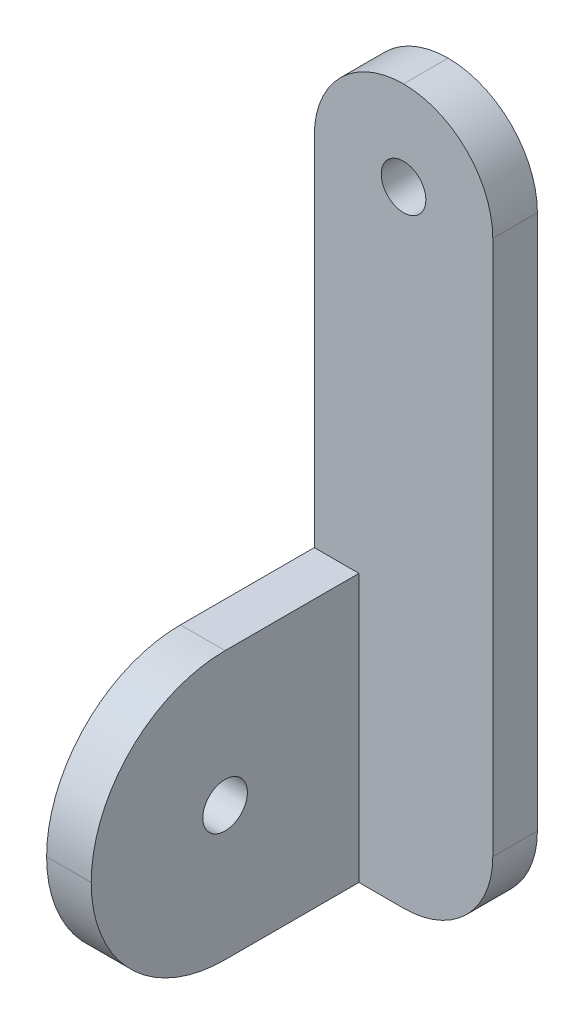
ISO-10303-21;
HEADER;
FILE_DESCRIPTION(('STEP AP214'),'2;1');
FILE_NAME('part.step','',(''),(''),'','','');
FILE_SCHEMA(('AUTOMOTIVE_DESIGN { 1 0 10303 214 1 1 1 1 }'));
ENDSEC;
DATA;
#1=APPLICATION_CONTEXT('core data for automotive mechanical design processes');
#2=APPLICATION_PROTOCOL_DEFINITION('international standard','automotive_design',2000,#1);
#3=PRODUCT_CONTEXT('',#1,'mechanical');
#4=PRODUCT('Part','Part','',(#3));
#5=PRODUCT_RELATED_PRODUCT_CATEGORY('part','',(#4));
#6=PRODUCT_DEFINITION_FORMATION('','',#4);
#7=PRODUCT_DEFINITION_CONTEXT('part definition',#1,'design');
#8=PRODUCT_DEFINITION('design','',#6,#7);
#9=PRODUCT_DEFINITION_SHAPE('','',#8);
#10=(LENGTH_UNIT() NAMED_UNIT(*) SI_UNIT(.MILLI.,.METRE.));
#11=(NAMED_UNIT(*) PLANE_ANGLE_UNIT() SI_UNIT($,.RADIAN.));
#12=(NAMED_UNIT(*) SI_UNIT($,.STERADIAN.) SOLID_ANGLE_UNIT());
#13=UNCERTAINTY_MEASURE_WITH_UNIT(LENGTH_MEASURE(1.E-05),#10,'distance_accuracy_value','');
#14=(GEOMETRIC_REPRESENTATION_CONTEXT(3) GLOBAL_UNCERTAINTY_ASSIGNED_CONTEXT((#13)) GLOBAL_UNIT_ASSIGNED_CONTEXT((#10,
#11,#12)) REPRESENTATION_CONTEXT('',''));
#15=CARTESIAN_POINT('',(0.,0.,0.));
#16=DIRECTION('',(0.,0.,1.));
#17=DIRECTION('',(1.,0.,0.));
#18=AXIS2_PLACEMENT_3D('',#15,#16,#17);
#19=CARTESIAN_POINT('',(-43.6932648054146,39.2711505922166,5.));
#20=DIRECTION('',(1.,0.,0.));
#21=DIRECTION('',(0.,1.,0.));
#22=AXIS2_PLACEMENT_3D('',#19,#20,#21);
#23=PLANE('',#22);
#24=CARTESIAN_POINT('',(-43.6932648054145,-25.7288494077834,20.));
#25=DIRECTION('',(-1.,0.,0.));
#26=DIRECTION('',(0.,-1.,0.));
#27=AXIS2_PLACEMENT_3D('',#24,#25,#26);
#28=CIRCLE('',#27,2.5);
#29=CARTESIAN_POINT('',(-43.6932648054145,-28.2288494077834,20.));
#30=VERTEX_POINT('',#29);
#31=EDGE_CURVE('E135',#30,#30,#28,.T.);
#32=ORIENTED_EDGE('',*,*,#31,.F.);
#33=EDGE_LOOP('',(#32));
#34=FACE_BOUND('',#33,.T.);
#35=DIRECTION('',(0.,-1.,0.));
#36=VECTOR('',#35,1.);
#37=CARTESIAN_POINT('',(-43.6932648054146,39.2711505922166,5.));
#38=LINE('',#37,#36);
#39=CARTESIAN_POINT('',(-43.6932648054146,29.2711505922166,5.));
#40=VERTEX_POINT('',#39);
#41=CARTESIAN_POINT('',(-43.6932648054145,-10.7288494077834,5.));
#42=VERTEX_POINT('',#41);
#43=EDGE_CURVE('E127',#40,#42,#38,.T.);
#44=ORIENTED_EDGE('',*,*,#43,.F.);
#45=DIRECTION('',(0.,0.,-1.));
#46=VECTOR('',#45,1.);
#47=CARTESIAN_POINT('',(-43.6932648054146,29.2711505922166,5.));
#48=LINE('',#47,#46);
#49=CARTESIAN_POINT('',(-43.6932648054146,29.2711505922166,0.));
#50=VERTEX_POINT('',#49);
#51=EDGE_CURVE('E11',#40,#50,#48,.T.);
#52=ORIENTED_EDGE('',*,*,#51,.T.);
#53=DIRECTION('',(0.,-1.,0.));
#54=VECTOR('',#53,1.);
#55=CARTESIAN_POINT('',(-43.6932648054146,39.2711505922166,0.));
#56=LINE('',#55,#54);
#57=CARTESIAN_POINT('',(-43.6932648054145,-40.7288494077834,0.));
#58=VERTEX_POINT('',#57);
#59=EDGE_CURVE('E193',#50,#58,#56,.T.);
#60=ORIENTED_EDGE('',*,*,#59,.T.);
#61=DIRECTION('',(0.,0.,-1.));
#62=VECTOR('',#61,1.);
#63=CARTESIAN_POINT('',(-43.6932648054145,-40.7288494077834,5.));
#64=LINE('',#63,#62);
#65=CARTESIAN_POINT('',(-43.6932648054145,-40.7288494077834,20.));
#66=VERTEX_POINT('',#65);
#67=EDGE_CURVE('E153',#66,#58,#64,.T.);
#68=ORIENTED_EDGE('',*,*,#67,.F.);
#69=CARTESIAN_POINT('',(-43.6932648054145,-25.7288494077834,20.));
#70=DIRECTION('',(1.,0.,0.));
#71=DIRECTION('',(0.,1.,0.));
#72=AXIS2_PLACEMENT_3D('',#69,#70,#71);
#73=CIRCLE('',#72,15.);
#74=CARTESIAN_POINT('',(-43.6932648054145,-25.7288494077834,35.));
#75=VERTEX_POINT('',#74);
#76=EDGE_CURVE('E162',#66,#75,#73,.F.);
#77=ORIENTED_EDGE('',*,*,#76,.T.);
#78=CARTESIAN_POINT('',(-43.6932648054145,-25.7288494077834,20.));
#79=DIRECTION('',(1.,0.,0.));
#80=DIRECTION('',(0.,1.,0.));
#81=AXIS2_PLACEMENT_3D('',#78,#79,#80);
#82=CIRCLE('',#81,15.);
#83=CARTESIAN_POINT('',(-43.6932648054145,-10.7288494077834,20.));
#84=VERTEX_POINT('',#83);
#85=EDGE_CURVE('E158',#75,#84,#82,.F.);
#86=ORIENTED_EDGE('',*,*,#85,.T.);
#87=DIRECTION('',(0.,0.,-1.));
#88=VECTOR('',#87,1.);
#89=CARTESIAN_POINT('',(-43.6932648054145,-10.7288494077834,35.));
#90=LINE('',#89,#88);
#91=EDGE_CURVE('E119',#84,#42,#90,.T.);
#92=ORIENTED_EDGE('',*,*,#91,.T.);
#93=EDGE_LOOP('',(#44,#52,#60,#68,#77,#86,#92));
#94=FACE_BOUND('',#93,.T.);
#95=ADVANCED_FACE('F33',(#34,#94),#23,.F.);
#96=CARTESIAN_POINT('',(-43.6932648054145,-40.7288494077834,5.));
#97=DIRECTION('',(0.,1.,0.));
#98=DIRECTION('',(0.,0.,1.));
#99=AXIS2_PLACEMENT_3D('',#96,#97,#98);
#100=PLANE('',#99);
#101=DIRECTION('',(1.,0.,0.));
#102=VECTOR('',#101,1.);
#103=CARTESIAN_POINT('',(-43.6932648054145,-40.7288494077834,0.));
#104=LINE('',#103,#102);
#105=CARTESIAN_POINT('',(-33.6932648054145,-40.7288494077834,0.));
#106=VERTEX_POINT('',#105);
#107=EDGE_CURVE('E195',#58,#106,#104,.T.);
#108=ORIENTED_EDGE('',*,*,#107,.T.);
#109=DIRECTION('',(0.,0.,-1.));
#110=VECTOR('',#109,1.);
#111=CARTESIAN_POINT('',(-33.6932648054145,-40.7288494077834,5.));
#112=LINE('',#111,#110);
#113=CARTESIAN_POINT('',(-33.6932648054145,-40.7288494077834,5.));
#114=VERTEX_POINT('',#113);
#115=EDGE_CURVE('E180',#106,#114,#112,.F.);
#116=ORIENTED_EDGE('',*,*,#115,.T.);
#117=DIRECTION('',(1.,0.,0.));
#118=VECTOR('',#117,1.);
#119=CARTESIAN_POINT('',(-43.6932648054145,-40.7288494077834,5.));
#120=LINE('',#119,#118);
#121=CARTESIAN_POINT('',(-38.6932648054145,-40.7288494077834,5.));
#122=VERTEX_POINT('',#121);
#123=EDGE_CURVE('E139',#122,#114,#120,.T.);
#124=ORIENTED_EDGE('',*,*,#123,.F.);
#125=DIRECTION('',(0.,0.,-1.));
#126=VECTOR('',#125,1.);
#127=CARTESIAN_POINT('',(-38.6932648054145,-40.7288494077834,35.));
#128=LINE('',#127,#126);
#129=CARTESIAN_POINT('',(-38.6932648054145,-40.7288494077834,20.));
#130=VERTEX_POINT('',#129);
#131=EDGE_CURVE('E118',#130,#122,#128,.T.);
#132=ORIENTED_EDGE('',*,*,#131,.F.);
#133=DIRECTION('',(1.,0.,0.));
#134=VECTOR('',#133,1.);
#135=CARTESIAN_POINT('',(-43.6932648054145,-40.7288494077834,20.));
#136=LINE('',#135,#134);
#137=EDGE_CURVE('E155',#130,#66,#136,.F.);
#138=ORIENTED_EDGE('',*,*,#137,.T.);
#139=ORIENTED_EDGE('',*,*,#67,.T.);
#140=EDGE_LOOP('',(#108,#116,#124,#132,#138,#139));
#141=FACE_BOUND('',#140,.T.);
#142=ADVANCED_FACE('F204',(#141),#100,.F.);
#143=CARTESIAN_POINT('',(-23.6932648054146,39.2711505922166,5.));
#144=DIRECTION('',(-1.,0.,0.));
#145=DIRECTION('',(0.,-1.,0.));
#146=AXIS2_PLACEMENT_3D('',#143,#144,#145);
#147=PLANE('',#146);
#148=DIRECTION('',(0.,1.,0.));
#149=VECTOR('',#148,1.);
#150=CARTESIAN_POINT('',(-23.6932648054146,39.2711505922166,5.));
#151=LINE('',#150,#149);
#152=CARTESIAN_POINT('',(-23.6932648054145,-30.7288494077834,5.));
#153=VERTEX_POINT('',#152);
#154=CARTESIAN_POINT('',(-23.6932648054146,29.2711505922166,5.));
#155=VERTEX_POINT('',#154);
#156=EDGE_CURVE('E191',#153,#155,#151,.T.);
#157=ORIENTED_EDGE('',*,*,#156,.F.);
#158=DIRECTION('',(0.,0.,-1.));
#159=VECTOR('',#158,1.);
#160=CARTESIAN_POINT('',(-23.6932648054145,-30.7288494077834,5.));
#161=LINE('',#160,#159);
#162=CARTESIAN_POINT('',(-23.6932648054145,-30.7288494077834,0.));
#163=VERTEX_POINT('',#162);
#164=EDGE_CURVE('E171',#153,#163,#161,.T.);
#165=ORIENTED_EDGE('',*,*,#164,.T.);
#166=DIRECTION('',(0.,1.,0.));
#167=VECTOR('',#166,1.);
#168=CARTESIAN_POINT('',(-23.6932648054146,39.2711505922166,0.));
#169=LINE('',#168,#167);
#170=CARTESIAN_POINT('',(-23.6932648054146,29.2711505922166,0.));
#171=VERTEX_POINT('',#170);
#172=EDGE_CURVE('E184',#163,#171,#169,.T.);
#173=ORIENTED_EDGE('',*,*,#172,.T.);
#174=DIRECTION('',(0.,0.,-1.));
#175=VECTOR('',#174,1.);
#176=CARTESIAN_POINT('',(-23.6932648054146,29.2711505922166,5.));
#177=LINE('',#176,#175);
#178=EDGE_CURVE('E165',#171,#155,#177,.F.);
#179=ORIENTED_EDGE('',*,*,#178,.T.);
#180=EDGE_LOOP('',(#157,#165,#173,#179));
#181=FACE_BOUND('',#180,.T.);
#182=ADVANCED_FACE('F219',(#181),#147,.F.);
#183=CARTESIAN_POINT('',(0.,0.,5.));
#184=DIRECTION('',(0.,0.,1.));
#185=DIRECTION('',(1.,0.,0.));
#186=AXIS2_PLACEMENT_3D('',#183,#184,#185);
#187=PLANE('',#186);
#188=ORIENTED_EDGE('',*,*,#123,.T.);
#189=CARTESIAN_POINT('',(-33.6932648054145,-30.7288494077834,5.));
#190=DIRECTION('',(0.,0.,1.));
#191=DIRECTION('',(1.,0.,0.));
#192=AXIS2_PLACEMENT_3D('',#189,#190,#191);
#193=CIRCLE('',#192,10.);
#194=EDGE_CURVE('E42',#114,#153,#193,.T.);
#195=ORIENTED_EDGE('',*,*,#194,.T.);
#196=ORIENTED_EDGE('',*,*,#156,.T.);
#197=CARTESIAN_POINT('',(-33.6932648054146,29.2711505922166,5.));
#198=DIRECTION('',(0.,0.,1.));
#199=DIRECTION('',(1.,0.,0.));
#200=AXIS2_PLACEMENT_3D('',#197,#198,#199);
#201=CIRCLE('',#200,10.);
#202=CARTESIAN_POINT('',(-33.6932648054146,39.2711505922166,5.));
#203=VERTEX_POINT('',#202);
#204=EDGE_CURVE('E54',#155,#203,#201,.T.);
#205=ORIENTED_EDGE('',*,*,#204,.T.);
#206=CARTESIAN_POINT('',(-33.6932648054146,29.2711505922166,5.));
#207=DIRECTION('',(0.,0.,1.));
#208=DIRECTION('',(1.,0.,0.));
#209=AXIS2_PLACEMENT_3D('',#206,#207,#208);
#210=CIRCLE('',#209,10.);
#211=EDGE_CURVE('E49',#203,#40,#210,.T.);
#212=ORIENTED_EDGE('',*,*,#211,.T.);
#213=ORIENTED_EDGE('',*,*,#43,.T.);
#214=DIRECTION('',(-1.,0.,0.));
#215=VECTOR('',#214,1.);
#216=CARTESIAN_POINT('',(-43.6932648054145,-10.7288494077834,5.));
#217=LINE('',#216,#215);
#218=CARTESIAN_POINT('',(-38.6932648054145,-10.7288494077834,5.));
#219=VERTEX_POINT('',#218);
#220=EDGE_CURVE('E112',#219,#42,#217,.T.);
#221=ORIENTED_EDGE('',*,*,#220,.F.);
#222=DIRECTION('',(0.,1.,0.));
#223=VECTOR('',#222,1.);
#224=CARTESIAN_POINT('',(-38.6932648054145,-40.7288494077834,5.));
#225=LINE('',#224,#223);
#226=EDGE_CURVE('E125',#122,#219,#225,.T.);
#227=ORIENTED_EDGE('',*,*,#226,.F.);
#228=EDGE_LOOP('',(#188,#195,#196,#205,#212,#213,#221,#227));
#229=FACE_BOUND('',#228,.T.);
#230=CARTESIAN_POINT('',(-33.6932648054146,29.2711505922166,5.));
#231=DIRECTION('',(0.,0.,1.));
#232=DIRECTION('',(1.,0.,0.));
#233=AXIS2_PLACEMENT_3D('',#230,#231,#232);
#234=CIRCLE('',#233,2.5);
#235=CARTESIAN_POINT('',(-31.1932648054145,29.2711505922166,5.));
#236=VERTEX_POINT('',#235);
#237=EDGE_CURVE('E149',#236,#236,#234,.T.);
#238=ORIENTED_EDGE('',*,*,#237,.F.);
#239=EDGE_LOOP('',(#238));
#240=FACE_BOUND('',#239,.T.);
#241=ADVANCED_FACE('F123',(#229,#240),#187,.T.);
#242=CARTESIAN_POINT('',(0.,0.,0.));
#243=DIRECTION('',(0.,0.,1.));
#244=DIRECTION('',(1.,0.,0.));
#245=AXIS2_PLACEMENT_3D('',#242,#243,#244);
#246=PLANE('',#245);
#247=CARTESIAN_POINT('',(-33.6932648054146,29.2711505922166,0.));
#248=DIRECTION('',(0.,0.,1.));
#249=DIRECTION('',(1.,0.,0.));
#250=AXIS2_PLACEMENT_3D('',#247,#248,#249);
#251=CIRCLE('',#250,2.5);
#252=CARTESIAN_POINT('',(-31.1932648054145,29.2711505922166,0.));
#253=VERTEX_POINT('',#252);
#254=EDGE_CURVE('E196',#253,#253,#251,.T.);
#255=ORIENTED_EDGE('',*,*,#254,.T.);
#256=EDGE_LOOP('',(#255));
#257=FACE_BOUND('',#256,.T.);
#258=ORIENTED_EDGE('',*,*,#172,.F.);
#259=CARTESIAN_POINT('',(-33.6932648054145,-30.7288494077834,0.));
#260=DIRECTION('',(0.,0.,1.));
#261=DIRECTION('',(1.,0.,0.));
#262=AXIS2_PLACEMENT_3D('',#259,#260,#261);
#263=CIRCLE('',#262,10.);
#264=EDGE_CURVE('E178',#163,#106,#263,.F.);
#265=ORIENTED_EDGE('',*,*,#264,.T.);
#266=ORIENTED_EDGE('',*,*,#107,.F.);
#267=ORIENTED_EDGE('',*,*,#59,.F.);
#268=CARTESIAN_POINT('',(-33.6932648054146,29.2711505922166,0.));
#269=DIRECTION('',(0.,0.,1.));
#270=DIRECTION('',(1.,0.,0.));
#271=AXIS2_PLACEMENT_3D('',#268,#269,#270);
#272=CIRCLE('',#271,10.);
#273=CARTESIAN_POINT('',(-33.6932648054146,39.2711505922166,0.));
#274=VERTEX_POINT('',#273);
#275=EDGE_CURVE('E174',#50,#274,#272,.F.);
#276=ORIENTED_EDGE('',*,*,#275,.T.);
#277=CARTESIAN_POINT('',(-33.6932648054146,29.2711505922166,0.));
#278=DIRECTION('',(0.,0.,1.));
#279=DIRECTION('',(1.,0.,0.));
#280=AXIS2_PLACEMENT_3D('',#277,#278,#279);
#281=CIRCLE('',#280,10.);
#282=EDGE_CURVE('E176',#274,#171,#281,.F.);
#283=ORIENTED_EDGE('',*,*,#282,.T.);
#284=EDGE_LOOP('',(#258,#265,#266,#267,#276,#283));
#285=FACE_BOUND('',#284,.T.);
#286=ADVANCED_FACE('F211',(#257,#285),#246,.F.);
#287=CARTESIAN_POINT('',(-33.6932648054146,29.2711505922166,0.));
#288=DIRECTION('',(0.,0.,1.));
#289=DIRECTION('',(1.,0.,0.));
#290=AXIS2_PLACEMENT_3D('',#287,#288,#289);
#291=CYLINDRICAL_SURFACE('',#290,2.5);
#292=ORIENTED_EDGE('',*,*,#254,.F.);
#293=EDGE_LOOP('',(#292));
#294=FACE_BOUND('',#293,.T.);
#295=ORIENTED_EDGE('',*,*,#237,.T.);
#296=EDGE_LOOP('',(#295));
#297=FACE_BOUND('',#296,.T.);
#298=ADVANCED_FACE('F254',(#294,#297),#291,.F.);
#299=CARTESIAN_POINT('',(-38.6932648054145,-40.7288494077834,35.));
#300=DIRECTION('',(-1.,0.,0.));
#301=DIRECTION('',(0.,0.,1.));
#302=AXIS2_PLACEMENT_3D('',#299,#300,#301);
#303=PLANE('',#302);
#304=CARTESIAN_POINT('',(-38.6932648054145,-25.7288494077834,20.));
#305=DIRECTION('',(-1.,0.,0.));
#306=DIRECTION('',(0.,0.,1.));
#307=AXIS2_PLACEMENT_3D('',#304,#305,#306);
#308=CIRCLE('',#307,2.5);
#309=CARTESIAN_POINT('',(-38.6932648054145,-25.7288494077834,22.5));
#310=VERTEX_POINT('',#309);
#311=EDGE_CURVE('E132',#310,#310,#308,.T.);
#312=ORIENTED_EDGE('',*,*,#311,.T.);
#313=EDGE_LOOP('',(#312));
#314=FACE_BOUND('',#313,.T.);
#315=CARTESIAN_POINT('',(-38.6932648054145,-25.7288494077834,20.));
#316=DIRECTION('',(-1.,0.,0.));
#317=DIRECTION('',(0.,0.,1.));
#318=AXIS2_PLACEMENT_3D('',#315,#316,#317);
#319=CIRCLE('',#318,15.);
#320=CARTESIAN_POINT('',(-38.6932648054145,-10.7288494077834,20.));
#321=VERTEX_POINT('',#320);
#322=CARTESIAN_POINT('',(-38.6932648054145,-25.7288494077834,35.));
#323=VERTEX_POINT('',#322);
#324=EDGE_CURVE('E150',#321,#323,#319,.F.);
#325=ORIENTED_EDGE('',*,*,#324,.T.);
#326=CARTESIAN_POINT('',(-38.6932648054145,-25.7288494077834,20.));
#327=DIRECTION('',(-1.,0.,0.));
#328=DIRECTION('',(0.,0.,1.));
#329=AXIS2_PLACEMENT_3D('',#326,#327,#328);
#330=CIRCLE('',#329,15.);
#331=EDGE_CURVE('E152',#323,#130,#330,.F.);
#332=ORIENTED_EDGE('',*,*,#331,.T.);
#333=ORIENTED_EDGE('',*,*,#131,.T.);
#334=ORIENTED_EDGE('',*,*,#226,.T.);
#335=DIRECTION('',(0.,0.,-1.));
#336=VECTOR('',#335,1.);
#337=CARTESIAN_POINT('',(-38.6932648054145,-10.7288494077834,35.));
#338=LINE('',#337,#336);
#339=EDGE_CURVE('E108',#321,#219,#338,.T.);
#340=ORIENTED_EDGE('',*,*,#339,.F.);
#341=EDGE_LOOP('',(#325,#332,#333,#334,#340));
#342=FACE_BOUND('',#341,.T.);
#343=ADVANCED_FACE('F130',(#314,#342),#303,.F.);
#344=CARTESIAN_POINT('',(-43.6932648054145,-10.7288494077834,35.));
#345=DIRECTION('',(0.,-1.,0.));
#346=DIRECTION('',(0.,0.,-1.));
#347=AXIS2_PLACEMENT_3D('',#344,#345,#346);
#348=PLANE('',#347);
#349=ORIENTED_EDGE('',*,*,#91,.F.);
#350=DIRECTION('',(-1.,0.,0.));
#351=VECTOR('',#350,1.);
#352=CARTESIAN_POINT('',(-43.6932648054145,-10.7288494077834,20.));
#353=LINE('',#352,#351);
#354=EDGE_CURVE('E114',#84,#321,#353,.F.);
#355=ORIENTED_EDGE('',*,*,#354,.T.);
#356=ORIENTED_EDGE('',*,*,#339,.T.);
#357=ORIENTED_EDGE('',*,*,#220,.T.);
#358=EDGE_LOOP('',(#349,#355,#356,#357));
#359=FACE_BOUND('',#358,.T.);
#360=ADVANCED_FACE('F111',(#359),#348,.F.);
#361=CARTESIAN_POINT('',(-13.6932648054145,-25.7288494077834,20.));
#362=DIRECTION('',(-1.,0.,0.));
#363=DIRECTION('',(0.,-1.,0.));
#364=AXIS2_PLACEMENT_3D('',#361,#362,#363);
#365=CYLINDRICAL_SURFACE('',#364,2.5);
#366=ORIENTED_EDGE('',*,*,#31,.T.);
#367=EDGE_LOOP('',(#366));
#368=FACE_BOUND('',#367,.T.);
#369=ORIENTED_EDGE('',*,*,#311,.F.);
#370=EDGE_LOOP('',(#369));
#371=FACE_BOUND('',#370,.T.);
#372=ADVANCED_FACE('F230',(#368,#371),#365,.F.);
#373=CARTESIAN_POINT('',(0.,-25.7288494077834,20.));
#374=DIRECTION('',(-1.,0.,0.));
#375=DIRECTION('',(0.,0.,1.));
#376=AXIS2_PLACEMENT_3D('',#373,#374,#375);
#377=CYLINDRICAL_SURFACE('',#376,15.);
#378=ORIENTED_EDGE('',*,*,#354,.F.);
#379=ORIENTED_EDGE('',*,*,#85,.F.);
#380=DIRECTION('',(-1.,0.,0.));
#381=VECTOR('',#380,1.);
#382=CARTESIAN_POINT('',(0.,-25.7288494077834,35.));
#383=LINE('',#382,#381);
#384=EDGE_CURVE('E166',#323,#75,#383,.T.);
#385=ORIENTED_EDGE('',*,*,#384,.F.);
#386=ORIENTED_EDGE('',*,*,#324,.F.);
#387=EDGE_LOOP('',(#378,#379,#385,#386));
#388=FACE_BOUND('',#387,.T.);
#389=ADVANCED_FACE('F228',(#388),#377,.T.);
#390=CARTESIAN_POINT('',(0.,-25.7288494077834,20.));
#391=DIRECTION('',(1.,0.,0.));
#392=DIRECTION('',(0.,0.,-1.));
#393=AXIS2_PLACEMENT_3D('',#390,#391,#392);
#394=CYLINDRICAL_SURFACE('',#393,15.);
#395=ORIENTED_EDGE('',*,*,#76,.F.);
#396=ORIENTED_EDGE('',*,*,#137,.F.);
#397=ORIENTED_EDGE('',*,*,#331,.F.);
#398=ORIENTED_EDGE('',*,*,#384,.T.);
#399=EDGE_LOOP('',(#395,#396,#397,#398));
#400=FACE_BOUND('',#399,.T.);
#401=ADVANCED_FACE('F224',(#400),#394,.T.);
#402=CARTESIAN_POINT('',(-33.6932648054145,-30.7288494077834,5.));
#403=DIRECTION('',(0.,0.,-1.));
#404=DIRECTION('',(-1.,0.,0.));
#405=AXIS2_PLACEMENT_3D('',#402,#403,#404);
#406=CYLINDRICAL_SURFACE('',#405,10.);
#407=ORIENTED_EDGE('',*,*,#194,.F.);
#408=ORIENTED_EDGE('',*,*,#115,.F.);
#409=ORIENTED_EDGE('',*,*,#264,.F.);
#410=ORIENTED_EDGE('',*,*,#164,.F.);
#411=EDGE_LOOP('',(#407,#408,#409,#410));
#412=FACE_BOUND('',#411,.T.);
#413=ADVANCED_FACE('F216',(#412),#406,.T.);
#414=CARTESIAN_POINT('',(-33.6932648054146,29.2711505922166,5.));
#415=DIRECTION('',(0.,0.,-1.));
#416=DIRECTION('',(-1.,0.,0.));
#417=AXIS2_PLACEMENT_3D('',#414,#415,#416);
#418=CYLINDRICAL_SURFACE('',#417,10.);
#419=ORIENTED_EDGE('',*,*,#51,.F.);
#420=ORIENTED_EDGE('',*,*,#211,.F.);
#421=DIRECTION('',(0.,0.,-1.));
#422=VECTOR('',#421,1.);
#423=CARTESIAN_POINT('',(-33.6932648054146,39.2711505922166,5.));
#424=LINE('',#423,#422);
#425=EDGE_CURVE('E37',#274,#203,#424,.F.);
#426=ORIENTED_EDGE('',*,*,#425,.F.);
#427=ORIENTED_EDGE('',*,*,#275,.F.);
#428=EDGE_LOOP('',(#419,#420,#426,#427));
#429=FACE_BOUND('',#428,.T.);
#430=ADVANCED_FACE('F35',(#429),#418,.T.);
#431=CARTESIAN_POINT('',(-33.6932648054146,29.2711505922166,5.));
#432=DIRECTION('',(0.,0.,-1.));
#433=DIRECTION('',(-1.,0.,0.));
#434=AXIS2_PLACEMENT_3D('',#431,#432,#433);
#435=CYLINDRICAL_SURFACE('',#434,10.);
#436=ORIENTED_EDGE('',*,*,#204,.F.);
#437=ORIENTED_EDGE('',*,*,#178,.F.);
#438=ORIENTED_EDGE('',*,*,#282,.F.);
#439=ORIENTED_EDGE('',*,*,#425,.T.);
#440=EDGE_LOOP('',(#436,#437,#438,#439));
#441=FACE_BOUND('',#440,.T.);
#442=ADVANCED_FACE('F291',(#441),#435,.T.);
#443=CLOSED_SHELL('',(#95,#142,#182,#241,#286,#298,#343,#360,#372,#389,#401,#413,#430,#442));
#444=MANIFOLD_SOLID_BREP('B2',#443);
#445=ADVANCED_BREP_SHAPE_REPRESENTATION('',(#18,#444),#14);
#446=SHAPE_DEFINITION_REPRESENTATION(#9,#445);
ENDSEC;
END-ISO-10303-21;
